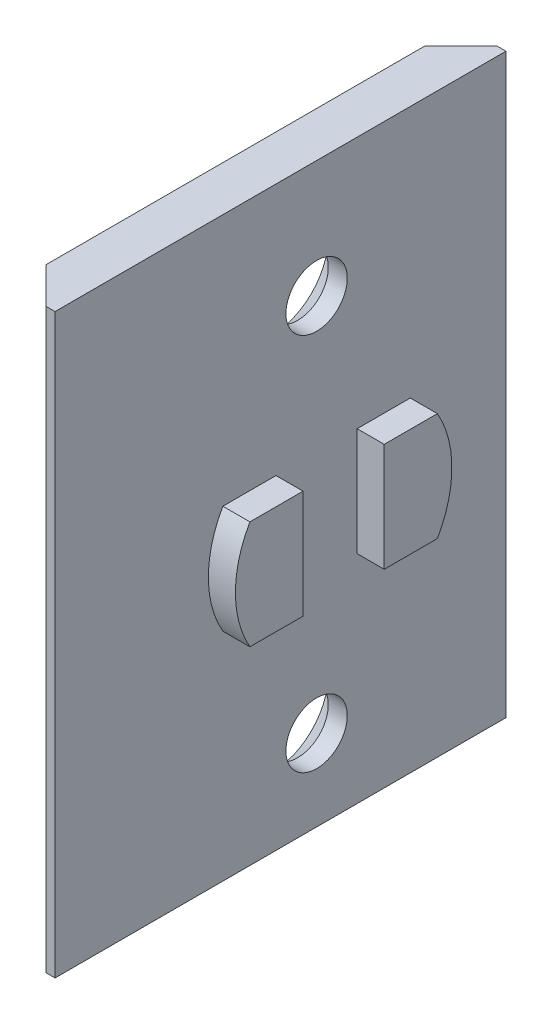
ISO-10303-21;
HEADER;
FILE_DESCRIPTION(('STEP AP214'),'2;1');
FILE_NAME('part.step','',(''),(''),'','','');
FILE_SCHEMA(('AUTOMOTIVE_DESIGN { 1 0 10303 214 1 1 1 1 }'));
ENDSEC;
DATA;
#1=APPLICATION_CONTEXT('core data for automotive mechanical design processes');
#2=APPLICATION_PROTOCOL_DEFINITION('international standard','automotive_design',2000,#1);
#3=PRODUCT_CONTEXT('',#1,'mechanical');
#4=PRODUCT('Part','Part','',(#3));
#5=PRODUCT_RELATED_PRODUCT_CATEGORY('part','',(#4));
#6=PRODUCT_DEFINITION_FORMATION('','',#4);
#7=PRODUCT_DEFINITION_CONTEXT('part definition',#1,'design');
#8=PRODUCT_DEFINITION('design','',#6,#7);
#9=PRODUCT_DEFINITION_SHAPE('','',#8);
#10=(LENGTH_UNIT() NAMED_UNIT(*) SI_UNIT(.MILLI.,.METRE.));
#11=(NAMED_UNIT(*) PLANE_ANGLE_UNIT() SI_UNIT($,.RADIAN.));
#12=(NAMED_UNIT(*) SI_UNIT($,.STERADIAN.) SOLID_ANGLE_UNIT());
#13=UNCERTAINTY_MEASURE_WITH_UNIT(LENGTH_MEASURE(1.E-05),#10,'distance_accuracy_value','');
#14=(GEOMETRIC_REPRESENTATION_CONTEXT(3) GLOBAL_UNCERTAINTY_ASSIGNED_CONTEXT((#13)) GLOBAL_UNIT_ASSIGNED_CONTEXT((#10,
#11,#12)) REPRESENTATION_CONTEXT('',''));
#15=CARTESIAN_POINT('',(0.,0.,0.));
#16=DIRECTION('',(0.,0.,1.));
#17=DIRECTION('',(1.,0.,0.));
#18=AXIS2_PLACEMENT_3D('',#15,#16,#17);
#19=CARTESIAN_POINT('',(4.,-1.,-2.00000000000008));
#20=DIRECTION('',(-1.,0.,0.));
#21=DIRECTION('',(0.,0.,1.00000000000003));
#22=AXIS2_PLACEMENT_3D('',#19,#20,#21);
#23=CYLINDRICAL_SURFACE('',#22,6.);
#24=DIRECTION('',(1.,0.,0.));
#25=VECTOR('',#24,1.);
#26=CARTESIAN_POINT('',(-8.31665382639201,-4.,3.19615242270658));
#27=LINE('',#26,#25);
#28=CARTESIAN_POINT('',(2.49999999999999,-4.,3.19615242270658));
#29=VERTEX_POINT('',#28);
#30=CARTESIAN_POINT('',(3.99999999999999,-4.,3.19615242270661));
#31=VERTEX_POINT('',#30);
#32=EDGE_CURVE('E51',#29,#31,#27,.T.);
#33=ORIENTED_EDGE('',*,*,#32,.T.);
#34=CARTESIAN_POINT('',(4.,-1.,-2.00000000000008));
#35=DIRECTION('',(1.,0.,0.));
#36=DIRECTION('',(0.,0.,-1.00000000000003));
#37=AXIS2_PLACEMENT_3D('',#34,#35,#36);
#38=CIRCLE('',#37,6.);
#39=CARTESIAN_POINT('',(4.,2.,3.19615242270661));
#40=VERTEX_POINT('',#39);
#41=EDGE_CURVE('E181',#40,#31,#38,.T.);
#42=ORIENTED_EDGE('',*,*,#41,.F.);
#43=DIRECTION('',(1.,0.,0.));
#44=VECTOR('',#43,1.);
#45=CARTESIAN_POINT('',(-8.31665382639201,2.00000000000001,3.19615242270658));
#46=LINE('',#45,#44);
#47=CARTESIAN_POINT('',(2.49999999999999,2.,3.1961524227066));
#48=VERTEX_POINT('',#47);
#49=EDGE_CURVE('E160',#48,#40,#46,.T.);
#50=ORIENTED_EDGE('',*,*,#49,.F.);
#51=CARTESIAN_POINT('',(2.5,-1.,-2.00000000000008));
#52=DIRECTION('',(-1.,0.,0.));
#53=DIRECTION('',(0.,0.,1.00000000000003));
#54=AXIS2_PLACEMENT_3D('',#51,#52,#53);
#55=CIRCLE('',#54,6.);
#56=EDGE_CURVE('E40',#48,#29,#55,.F.);
#57=ORIENTED_EDGE('',*,*,#56,.T.);
#58=EDGE_LOOP('',(#33,#42,#50,#57));
#59=FACE_BOUND('',#58,.T.);
#60=ADVANCED_FACE('F36',(#59),#23,.T.);
#61=CARTESIAN_POINT('',(4.,0.,0.));
#62=DIRECTION('',(1.,0.,0.));
#63=DIRECTION('',(0.,0.,-1.00000000000003));
#64=AXIS2_PLACEMENT_3D('',#61,#62,#63);
#65=PLANE('',#64);
#66=ORIENTED_EDGE('',*,*,#41,.T.);
#67=DIRECTION('',(0.,0.,-1.));
#68=VECTOR('',#67,1.);
#69=CARTESIAN_POINT('',(4.,-4.,0.));
#70=LINE('',#69,#68);
#71=CARTESIAN_POINT('',(4.,-4.,0.249999999999981));
#72=VERTEX_POINT('',#71);
#73=EDGE_CURVE('E258',#31,#72,#70,.T.);
#74=ORIENTED_EDGE('',*,*,#73,.T.);
#75=DIRECTION('',(0.,1.,0.));
#76=VECTOR('',#75,1.);
#77=CARTESIAN_POINT('',(4.,0.,0.24999999999999));
#78=LINE('',#77,#76);
#79=CARTESIAN_POINT('',(4.,2.,0.249999999999999));
#80=VERTEX_POINT('',#79);
#81=EDGE_CURVE('E177',#72,#80,#78,.T.);
#82=ORIENTED_EDGE('',*,*,#81,.T.);
#83=DIRECTION('',(0.,0.,-1.));
#84=VECTOR('',#83,1.);
#85=CARTESIAN_POINT('',(4.,2.,0.));
#86=LINE('',#85,#84);
#87=EDGE_CURVE('E164',#40,#80,#86,.T.);
#88=ORIENTED_EDGE('',*,*,#87,.F.);
#89=EDGE_LOOP('',(#66,#74,#82,#88));
#90=FACE_BOUND('',#89,.T.);
#91=ADVANCED_FACE('F279',(#90),#65,.T.);
#92=CARTESIAN_POINT('',(4.,0.,-4.25000000000015));
#93=DIRECTION('',(0.,0.,1.00000000000003));
#94=DIRECTION('',(1.,0.,0.));
#95=AXIS2_PLACEMENT_3D('',#92,#93,#94);
#96=PLANE('',#95);
#97=DIRECTION('',(0.,1.,0.));
#98=VECTOR('',#97,1.);
#99=CARTESIAN_POINT('',(2.5,0.,-4.25000000000015));
#100=LINE('',#99,#98);
#101=CARTESIAN_POINT('',(2.5,-4.,-4.25000000000016));
#102=VERTEX_POINT('',#101);
#103=CARTESIAN_POINT('',(2.50000000000001,2.,-4.25000000000015));
#104=VERTEX_POINT('',#103);
#105=EDGE_CURVE('E155',#102,#104,#100,.T.);
#106=ORIENTED_EDGE('',*,*,#105,.F.);
#107=DIRECTION('',(1.,0.,0.));
#108=VECTOR('',#107,1.);
#109=CARTESIAN_POINT('',(4.,-4.,-4.25000000000017));
#110=LINE('',#109,#108);
#111=CARTESIAN_POINT('',(4.,-4.,-4.25000000000009));
#112=VERTEX_POINT('',#111);
#113=EDGE_CURVE('E141',#102,#112,#110,.T.);
#114=ORIENTED_EDGE('',*,*,#113,.T.);
#115=DIRECTION('',(0.,1.,0.));
#116=VECTOR('',#115,1.);
#117=CARTESIAN_POINT('',(4.,0.,-4.25000000000015));
#118=LINE('',#117,#116);
#119=CARTESIAN_POINT('',(4.00000000000001,2.,-4.25000000000009));
#120=VERTEX_POINT('',#119);
#121=EDGE_CURVE('E175',#112,#120,#118,.T.);
#122=ORIENTED_EDGE('',*,*,#121,.T.);
#123=DIRECTION('',(1.,0.,0.));
#124=VECTOR('',#123,1.);
#125=CARTESIAN_POINT('',(4.,2.,-4.25000000000014));
#126=LINE('',#125,#124);
#127=EDGE_CURVE('E173',#104,#120,#126,.T.);
#128=ORIENTED_EDGE('',*,*,#127,.F.);
#129=EDGE_LOOP('',(#106,#114,#122,#128));
#130=FACE_BOUND('',#129,.T.);
#131=ADVANCED_FACE('F282',(#130),#96,.T.);
#132=CARTESIAN_POINT('',(4.,0.,0.24999999999999));
#133=DIRECTION('',(0.,0.,1.00000000000003));
#134=DIRECTION('',(1.,0.,0.));
#135=AXIS2_PLACEMENT_3D('',#132,#133,#134);
#136=PLANE('',#135);
#137=DIRECTION('',(1.,0.,0.));
#138=VECTOR('',#137,1.);
#139=CARTESIAN_POINT('',(4.,-4.,0.24999999999998));
#140=LINE('',#139,#138);
#141=CARTESIAN_POINT('',(2.5,-4.,0.250000000000006));
#142=VERTEX_POINT('',#141);
#143=EDGE_CURVE('E262',#142,#72,#140,.T.);
#144=ORIENTED_EDGE('',*,*,#143,.F.);
#145=DIRECTION('',(0.,1.,0.));
#146=VECTOR('',#145,1.);
#147=CARTESIAN_POINT('',(2.5,0.,0.24999999999999));
#148=LINE('',#147,#146);
#149=CARTESIAN_POINT('',(2.5,2.,0.250000000000005));
#150=VERTEX_POINT('',#149);
#151=EDGE_CURVE('E178',#142,#150,#148,.T.);
#152=ORIENTED_EDGE('',*,*,#151,.T.);
#153=DIRECTION('',(1.,0.,0.));
#154=VECTOR('',#153,1.);
#155=CARTESIAN_POINT('',(4.,2.,0.249999999999997));
#156=LINE('',#155,#154);
#157=EDGE_CURVE('E170',#150,#80,#156,.T.);
#158=ORIENTED_EDGE('',*,*,#157,.T.);
#159=ORIENTED_EDGE('',*,*,#81,.F.);
#160=EDGE_LOOP('',(#144,#152,#158,#159));
#161=FACE_BOUND('',#160,.T.);
#162=ADVANCED_FACE('F276',(#161),#136,.F.);
#163=DIRECTION('',(1.,0.,0.));
#164=VECTOR('',#163,1.);
#165=CARTESIAN_POINT('',(-8.31665382639199,-4.,-7.19615242270676));
#166=LINE('',#165,#164);
#167=CARTESIAN_POINT('',(2.49999999999999,-4.,-7.19615242270674));
#168=VERTEX_POINT('',#167);
#169=CARTESIAN_POINT('',(4.00000000000001,-4.,-7.19615242270674));
#170=VERTEX_POINT('',#169);
#171=EDGE_CURVE('E138',#168,#170,#166,.T.);
#172=ORIENTED_EDGE('',*,*,#171,.F.);
#173=CARTESIAN_POINT('',(2.50000000000001,2.,-7.19615242270674));
#174=VERTEX_POINT('',#173);
#175=EDGE_CURVE('E11',#168,#174,#55,.F.);
#176=ORIENTED_EDGE('',*,*,#175,.T.);
#177=DIRECTION('',(1.,0.,0.));
#178=VECTOR('',#177,1.);
#179=CARTESIAN_POINT('',(-8.31665382639199,2.00000000000001,-7.19615242270676));
#180=LINE('',#179,#178);
#181=CARTESIAN_POINT('',(4.00000000000001,2.,-7.19615242270674));
#182=VERTEX_POINT('',#181);
#183=EDGE_CURVE('E163',#174,#182,#180,.T.);
#184=ORIENTED_EDGE('',*,*,#183,.T.);
#185=EDGE_CURVE('E148',#170,#182,#38,.T.);
#186=ORIENTED_EDGE('',*,*,#185,.F.);
#187=EDGE_LOOP('',(#172,#176,#184,#186));
#188=FACE_BOUND('',#187,.T.);
#189=ADVANCED_FACE('F147',(#188),#23,.T.);
#190=ORIENTED_EDGE('',*,*,#121,.F.);
#191=EDGE_CURVE('E261',#112,#170,#70,.T.);
#192=ORIENTED_EDGE('',*,*,#191,.T.);
#193=ORIENTED_EDGE('',*,*,#185,.T.);
#194=EDGE_CURVE('E263',#120,#182,#86,.T.);
#195=ORIENTED_EDGE('',*,*,#194,.F.);
#196=EDGE_LOOP('',(#190,#192,#193,#195));
#197=FACE_BOUND('',#196,.T.);
#198=ADVANCED_FACE('F281',(#197),#65,.T.);
#199=CARTESIAN_POINT('',(2.5,-16.,-12.5000000000003));
#200=DIRECTION('',(0.,0.,1.00000000000003));
#201=DIRECTION('',(1.,0.,0.));
#202=AXIS2_PLACEMENT_3D('',#199,#200,#201);
#203=PLANE('',#202);
#204=DIRECTION('',(-1.,0.,0.));
#205=VECTOR('',#204,1.);
#206=CARTESIAN_POINT('',(2.5,-16.,-12.5000000000003));
#207=LINE('',#206,#205);
#208=CARTESIAN_POINT('',(2.5,-16.,-12.5000000000003));
#209=VERTEX_POINT('',#208);
#210=CARTESIAN_POINT('',(2.,-16.,-12.5000000000003));
#211=VERTEX_POINT('',#210);
#212=EDGE_CURVE('E213',#209,#211,#207,.T.);
#213=ORIENTED_EDGE('',*,*,#212,.T.);
#214=DIRECTION('',(0.,1.,0.));
#215=VECTOR('',#214,1.);
#216=CARTESIAN_POINT('',(2.,16.,-12.5000000000005));
#217=LINE('',#216,#215);
#218=CARTESIAN_POINT('',(2.,16.,-12.5000000000005));
#219=VERTEX_POINT('',#218);
#220=EDGE_CURVE('E243',#211,#219,#217,.T.);
#221=ORIENTED_EDGE('',*,*,#220,.T.);
#222=DIRECTION('',(-1.,0.,0.));
#223=VECTOR('',#222,1.);
#224=CARTESIAN_POINT('',(2.5,16.,-12.5000000000005));
#225=LINE('',#224,#223);
#226=CARTESIAN_POINT('',(2.5,16.,-12.5000000000005));
#227=VERTEX_POINT('',#226);
#228=EDGE_CURVE('E226',#227,#219,#225,.T.);
#229=ORIENTED_EDGE('',*,*,#228,.F.);
#230=DIRECTION('',(0.,1.,0.));
#231=VECTOR('',#230,1.);
#232=CARTESIAN_POINT('',(2.5,-16.,-12.5000000000003));
#233=LINE('',#232,#231);
#234=EDGE_CURVE('E203',#209,#227,#233,.T.);
#235=ORIENTED_EDGE('',*,*,#234,.F.);
#236=EDGE_LOOP('',(#213,#221,#229,#235));
#237=FACE_BOUND('',#236,.T.);
#238=ADVANCED_FACE('F305',(#237),#203,.F.);
#239=CARTESIAN_POINT('',(2.5,16.,12.5000000000005));
#240=DIRECTION('',(0.,-1.,0.));
#241=DIRECTION('',(0.,0.,-1.00000000000003));
#242=AXIS2_PLACEMENT_3D('',#239,#240,#241);
#243=PLANE('',#242);
#244=DIRECTION('',(0.,0.,1.00000000000003));
#245=VECTOR('',#244,1.);
#246=CARTESIAN_POINT('',(0.,16.,12.5000000000003));
#247=LINE('',#246,#245);
#248=CARTESIAN_POINT('',(0.,16.,-10.5000000000005));
#249=VERTEX_POINT('',#248);
#250=CARTESIAN_POINT('',(0.,16.,10.5000000000003));
#251=VERTEX_POINT('',#250);
#252=EDGE_CURVE('E202',#249,#251,#247,.T.);
#253=ORIENTED_EDGE('',*,*,#252,.T.);
#254=DIRECTION('',(0.707106781186547,0.,0.707106781186565));
#255=VECTOR('',#254,1.);
#256=CARTESIAN_POINT('',(2.,16.,12.5000000000005));
#257=LINE('',#256,#255);
#258=CARTESIAN_POINT('',(2.,16.,12.5000000000005));
#259=VERTEX_POINT('',#258);
#260=EDGE_CURVE('E242',#251,#259,#257,.T.);
#261=ORIENTED_EDGE('',*,*,#260,.T.);
#262=DIRECTION('',(-1.,0.,0.));
#263=VECTOR('',#262,1.);
#264=CARTESIAN_POINT('',(2.5,16.,12.5000000000005));
#265=LINE('',#264,#263);
#266=CARTESIAN_POINT('',(2.5,16.,12.5000000000005));
#267=VERTEX_POINT('',#266);
#268=EDGE_CURVE('E223',#267,#259,#265,.T.);
#269=ORIENTED_EDGE('',*,*,#268,.F.);
#270=DIRECTION('',(0.,0.,1.00000000000003));
#271=VECTOR('',#270,1.);
#272=CARTESIAN_POINT('',(2.5,16.,12.5000000000005));
#273=LINE('',#272,#271);
#274=EDGE_CURVE('E206',#227,#267,#273,.T.);
#275=ORIENTED_EDGE('',*,*,#274,.F.);
#276=ORIENTED_EDGE('',*,*,#228,.T.);
#277=DIRECTION('',(-0.707106781186547,0.,0.707106781186565));
#278=VECTOR('',#277,1.);
#279=CARTESIAN_POINT('',(2.,16.,-12.5000000000005));
#280=LINE('',#279,#278);
#281=EDGE_CURVE('E240',#219,#249,#280,.T.);
#282=ORIENTED_EDGE('',*,*,#281,.T.);
#283=EDGE_LOOP('',(#253,#261,#269,#275,#276,#282));
#284=FACE_BOUND('',#283,.T.);
#285=ADVANCED_FACE('F338',(#284),#243,.F.);
#286=CARTESIAN_POINT('',(2.5,-16.,12.5000000000005));
#287=DIRECTION('',(0.,0.,-1.00000000000003));
#288=DIRECTION('',(-1.,0.,0.));
#289=AXIS2_PLACEMENT_3D('',#286,#287,#288);
#290=PLANE('',#289);
#291=ORIENTED_EDGE('',*,*,#268,.T.);
#292=DIRECTION('',(0.,-1.,0.));
#293=VECTOR('',#292,1.);
#294=CARTESIAN_POINT('',(2.,-16.,12.5000000000005));
#295=LINE('',#294,#293);
#296=CARTESIAN_POINT('',(2.,-16.,12.5000000000005));
#297=VERTEX_POINT('',#296);
#298=EDGE_CURVE('E229',#259,#297,#295,.T.);
#299=ORIENTED_EDGE('',*,*,#298,.T.);
#300=DIRECTION('',(-1.,0.,0.));
#301=VECTOR('',#300,1.);
#302=CARTESIAN_POINT('',(2.5,-16.,12.5000000000005));
#303=LINE('',#302,#301);
#304=CARTESIAN_POINT('',(2.5,-16.,12.5000000000005));
#305=VERTEX_POINT('',#304);
#306=EDGE_CURVE('E220',#305,#297,#303,.T.);
#307=ORIENTED_EDGE('',*,*,#306,.F.);
#308=DIRECTION('',(0.,-1.,0.));
#309=VECTOR('',#308,1.);
#310=CARTESIAN_POINT('',(2.5,-16.,12.5000000000005));
#311=LINE('',#310,#309);
#312=EDGE_CURVE('E209',#267,#305,#311,.T.);
#313=ORIENTED_EDGE('',*,*,#312,.F.);
#314=EDGE_LOOP('',(#291,#299,#307,#313));
#315=FACE_BOUND('',#314,.T.);
#316=ADVANCED_FACE('F334',(#315),#290,.F.);
#317=CARTESIAN_POINT('',(2.5,-16.,12.5000000000005));
#318=DIRECTION('',(0.,1.,0.));
#319=DIRECTION('',(0.,0.,1.00000000000003));
#320=AXIS2_PLACEMENT_3D('',#317,#318,#319);
#321=PLANE('',#320);
#322=ORIENTED_EDGE('',*,*,#306,.T.);
#323=DIRECTION('',(-0.707106781186547,0.,-0.707106781186565));
#324=VECTOR('',#323,1.);
#325=CARTESIAN_POINT('',(2.,-16.,12.5000000000005));
#326=LINE('',#325,#324);
#327=CARTESIAN_POINT('',(0.,-16.,10.5000000000005));
#328=VERTEX_POINT('',#327);
#329=EDGE_CURVE('E234',#297,#328,#326,.T.);
#330=ORIENTED_EDGE('',*,*,#329,.T.);
#331=DIRECTION('',(0.,0.,-1.00000000000003));
#332=VECTOR('',#331,1.);
#333=CARTESIAN_POINT('',(0.,-16.,12.5000000000005));
#334=LINE('',#333,#332);
#335=CARTESIAN_POINT('',(0.,-16.,-10.5000000000003));
#336=VERTEX_POINT('',#335);
#337=EDGE_CURVE('E207',#328,#336,#334,.T.);
#338=ORIENTED_EDGE('',*,*,#337,.T.);
#339=DIRECTION('',(0.707106781186547,0.,-0.707106781186565));
#340=VECTOR('',#339,1.);
#341=CARTESIAN_POINT('',(2.,-16.,-12.5000000000003));
#342=LINE('',#341,#340);
#343=EDGE_CURVE('E232',#336,#211,#342,.T.);
#344=ORIENTED_EDGE('',*,*,#343,.T.);
#345=ORIENTED_EDGE('',*,*,#212,.F.);
#346=DIRECTION('',(0.,0.,-1.00000000000003));
#347=VECTOR('',#346,1.);
#348=CARTESIAN_POINT('',(2.5,-16.,12.5000000000005));
#349=LINE('',#348,#347);
#350=EDGE_CURVE('E211',#305,#209,#349,.T.);
#351=ORIENTED_EDGE('',*,*,#350,.F.);
#352=EDGE_LOOP('',(#322,#330,#338,#344,#345,#351));
#353=FACE_BOUND('',#352,.T.);
#354=ADVANCED_FACE('F330',(#353),#321,.F.);
#355=CARTESIAN_POINT('',(0.,0.,0.));
#356=DIRECTION('',(-1.,0.,0.));
#357=DIRECTION('',(0.,0.,1.00000000000003));
#358=AXIS2_PLACEMENT_3D('',#355,#356,#357);
#359=PLANE('',#358);
#360=CARTESIAN_POINT('',(0.,-11.5,-2.00000000000008));
#361=DIRECTION('',(-1.,0.,0.));
#362=DIRECTION('',(0.,0.,1.00000000000003));
#363=AXIS2_PLACEMENT_3D('',#360,#361,#362);
#364=CIRCLE('',#363,3.15);
#365=CARTESIAN_POINT('',(0.,-11.5,1.15000000000003));
#366=VERTEX_POINT('',#365);
#367=EDGE_CURVE('E184',#366,#366,#364,.T.);
#368=ORIENTED_EDGE('',*,*,#367,.F.);
#369=EDGE_LOOP('',(#368));
#370=FACE_BOUND('',#369,.T.);
#371=CARTESIAN_POINT('',(0.,9.5,-2.00000000000015));
#372=DIRECTION('',(-1.,0.,0.));
#373=DIRECTION('',(0.,0.,1.00000000000003));
#374=AXIS2_PLACEMENT_3D('',#371,#372,#373);
#375=CIRCLE('',#374,3.15);
#376=CARTESIAN_POINT('',(0.,9.49999999999999,1.14999999999996));
#377=VERTEX_POINT('',#376);
#378=EDGE_CURVE('E193',#377,#377,#375,.T.);
#379=ORIENTED_EDGE('',*,*,#378,.F.);
#380=EDGE_LOOP('',(#379));
#381=FACE_BOUND('',#380,.T.);
#382=ORIENTED_EDGE('',*,*,#337,.F.);
#383=DIRECTION('',(0.,1.,0.));
#384=VECTOR('',#383,1.);
#385=CARTESIAN_POINT('',(0.,16.,10.5000000000003));
#386=LINE('',#385,#384);
#387=EDGE_CURVE('E238',#328,#251,#386,.T.);
#388=ORIENTED_EDGE('',*,*,#387,.T.);
#389=ORIENTED_EDGE('',*,*,#252,.F.);
#390=DIRECTION('',(0.,-1.,0.));
#391=VECTOR('',#390,1.);
#392=CARTESIAN_POINT('',(0.,-16.,-10.5000000000003));
#393=LINE('',#392,#391);
#394=EDGE_CURVE('E236',#249,#336,#393,.T.);
#395=ORIENTED_EDGE('',*,*,#394,.T.);
#396=EDGE_LOOP('',(#382,#388,#389,#395));
#397=FACE_BOUND('',#396,.T.);
#398=ADVANCED_FACE('F326',(#370,#381,#397),#359,.T.);
#399=CARTESIAN_POINT('',(2.,-16.,12.5000000000005));
#400=DIRECTION('',(-0.707106781186548,0.,0.707106781186564));
#401=DIRECTION('',(0.,1.,0.));
#402=AXIS2_PLACEMENT_3D('',#399,#400,#401);
#403=PLANE('',#402);
#404=ORIENTED_EDGE('',*,*,#260,.F.);
#405=ORIENTED_EDGE('',*,*,#387,.F.);
#406=ORIENTED_EDGE('',*,*,#329,.F.);
#407=ORIENTED_EDGE('',*,*,#298,.F.);
#408=EDGE_LOOP('',(#404,#405,#406,#407));
#409=FACE_BOUND('',#408,.T.);
#410=ADVANCED_FACE('F329',(#409),#403,.T.);
#411=CARTESIAN_POINT('',(2.,-16.,-12.5000000000003));
#412=DIRECTION('',(-0.707106781186548,0.,-0.707106781186564));
#413=DIRECTION('',(0.,-1.,0.));
#414=AXIS2_PLACEMENT_3D('',#411,#412,#413);
#415=PLANE('',#414);
#416=ORIENTED_EDGE('',*,*,#343,.F.);
#417=ORIENTED_EDGE('',*,*,#394,.F.);
#418=ORIENTED_EDGE('',*,*,#281,.F.);
#419=ORIENTED_EDGE('',*,*,#220,.F.);
#420=EDGE_LOOP('',(#416,#417,#418,#419));
#421=FACE_BOUND('',#420,.T.);
#422=ADVANCED_FACE('F38',(#421),#415,.T.);
#423=CARTESIAN_POINT('',(0.,9.5,-2.00000000000015));
#424=DIRECTION('',(-1.,0.,0.));
#425=DIRECTION('',(0.,0.,1.00000000000003));
#426=AXIS2_PLACEMENT_3D('',#423,#424,#425);
#427=CYLINDRICAL_SURFACE('',#426,1.7);
#428=CARTESIAN_POINT('',(2.5,9.5,-2.00000000000015));
#429=DIRECTION('',(-1.,0.,0.));
#430=DIRECTION('',(0.,0.,1.00000000000003));
#431=AXIS2_PLACEMENT_3D('',#428,#429,#430);
#432=CIRCLE('',#431,1.7);
#433=CARTESIAN_POINT('',(2.5,9.49999999999999,-0.300000000000093));
#434=VERTEX_POINT('',#433);
#435=EDGE_CURVE('E199',#434,#434,#432,.T.);
#436=ORIENTED_EDGE('',*,*,#435,.F.);
#437=EDGE_LOOP('',(#436));
#438=FACE_BOUND('',#437,.T.);
#439=CARTESIAN_POINT('',(1.45,9.5,-2.00000000000015));
#440=DIRECTION('',(-1.,0.,0.));
#441=DIRECTION('',(0.,0.,1.00000000000003));
#442=AXIS2_PLACEMENT_3D('',#439,#440,#441);
#443=CIRCLE('',#442,1.7);
#444=CARTESIAN_POINT('',(1.45000000000001,9.49999999999999,-0.300000000000093));
#445=VERTEX_POINT('',#444);
#446=EDGE_CURVE('E196',#445,#445,#443,.T.);
#447=ORIENTED_EDGE('',*,*,#446,.T.);
#448=EDGE_LOOP('',(#447));
#449=FACE_BOUND('',#448,.T.);
#450=ADVANCED_FACE('F321',(#438,#449),#427,.F.);
#451=CARTESIAN_POINT('',(0.,9.5,-2.00000000000015));
#452=DIRECTION('',(-1.,0.,0.));
#453=DIRECTION('',(0.,0.,1.00000000000003));
#454=AXIS2_PLACEMENT_3D('',#451,#452,#453);
#455=CONICAL_SURFACE('',#454,3.15,0.785398163397448);
#456=ORIENTED_EDGE('',*,*,#446,.F.);
#457=EDGE_LOOP('',(#456));
#458=FACE_BOUND('',#457,.T.);
#459=ORIENTED_EDGE('',*,*,#378,.T.);
#460=EDGE_LOOP('',(#459));
#461=FACE_BOUND('',#460,.T.);
#462=ADVANCED_FACE('F317',(#458,#461),#455,.F.);
#463=CARTESIAN_POINT('',(0.,-11.5,-2.00000000000008));
#464=DIRECTION('',(-1.,0.,0.));
#465=DIRECTION('',(0.,0.,1.00000000000003));
#466=AXIS2_PLACEMENT_3D('',#463,#464,#465);
#467=CYLINDRICAL_SURFACE('',#466,1.7);
#468=CARTESIAN_POINT('',(2.5,-11.5,-2.00000000000001));
#469=DIRECTION('',(-1.,0.,0.));
#470=DIRECTION('',(0.,0.,1.00000000000003));
#471=AXIS2_PLACEMENT_3D('',#468,#469,#470);
#472=CIRCLE('',#471,1.7);
#473=CARTESIAN_POINT('',(2.5,-11.5,-0.299999999999956));
#474=VERTEX_POINT('',#473);
#475=EDGE_CURVE('E190',#474,#474,#472,.T.);
#476=ORIENTED_EDGE('',*,*,#475,.F.);
#477=EDGE_LOOP('',(#476));
#478=FACE_BOUND('',#477,.T.);
#479=CARTESIAN_POINT('',(1.45,-11.5,-2.00000000000001));
#480=DIRECTION('',(-1.,0.,0.));
#481=DIRECTION('',(0.,0.,1.00000000000003));
#482=AXIS2_PLACEMENT_3D('',#479,#480,#481);
#483=CIRCLE('',#482,1.7);
#484=CARTESIAN_POINT('',(1.45000000000001,-11.5,-0.299999999999956));
#485=VERTEX_POINT('',#484);
#486=EDGE_CURVE('E187',#485,#485,#483,.T.);
#487=ORIENTED_EDGE('',*,*,#486,.T.);
#488=EDGE_LOOP('',(#487));
#489=FACE_BOUND('',#488,.T.);
#490=ADVANCED_FACE('F313',(#478,#489),#467,.F.);
#491=CARTESIAN_POINT('',(0.,-11.5,-2.00000000000008));
#492=DIRECTION('',(-1.,0.,0.));
#493=DIRECTION('',(0.,0.,1.00000000000003));
#494=AXIS2_PLACEMENT_3D('',#491,#492,#493);
#495=CONICAL_SURFACE('',#494,3.15,0.785398163397448);
#496=ORIENTED_EDGE('',*,*,#486,.F.);
#497=EDGE_LOOP('',(#496));
#498=FACE_BOUND('',#497,.T.);
#499=ORIENTED_EDGE('',*,*,#367,.T.);
#500=EDGE_LOOP('',(#499));
#501=FACE_BOUND('',#500,.T.);
#502=ADVANCED_FACE('F290',(#498,#501),#495,.F.);
#503=CARTESIAN_POINT('',(2.5,0.,0.));
#504=DIRECTION('',(-1.,0.,0.));
#505=DIRECTION('',(0.,0.,1.00000000000003));
#506=AXIS2_PLACEMENT_3D('',#503,#504,#505);
#507=PLANE('',#506);
#508=DIRECTION('',(0.,0.,-1.));
#509=VECTOR('',#508,1.);
#510=CARTESIAN_POINT('',(2.5,-4.,0.));
#511=LINE('',#510,#509);
#512=EDGE_CURVE('E136',#102,#168,#511,.T.);
#513=ORIENTED_EDGE('',*,*,#512,.F.);
#514=ORIENTED_EDGE('',*,*,#105,.T.);
#515=DIRECTION('',(0.,0.,-1.));
#516=VECTOR('',#515,1.);
#517=CARTESIAN_POINT('',(2.5,2.,0.));
#518=LINE('',#517,#516);
#519=EDGE_CURVE('E154',#104,#174,#518,.T.);
#520=ORIENTED_EDGE('',*,*,#519,.T.);
#521=ORIENTED_EDGE('',*,*,#175,.F.);
#522=EDGE_LOOP('',(#513,#514,#520,#521));
#523=FACE_BOUND('',#522,.T.);
#524=ORIENTED_EDGE('',*,*,#151,.F.);
#525=EDGE_CURVE('E144',#29,#142,#511,.T.);
#526=ORIENTED_EDGE('',*,*,#525,.F.);
#527=ORIENTED_EDGE('',*,*,#56,.F.);
#528=EDGE_CURVE('E159',#48,#150,#518,.T.);
#529=ORIENTED_EDGE('',*,*,#528,.T.);
#530=EDGE_LOOP('',(#524,#526,#527,#529));
#531=FACE_BOUND('',#530,.T.);
#532=ORIENTED_EDGE('',*,*,#234,.T.);
#533=ORIENTED_EDGE('',*,*,#274,.T.);
#534=ORIENTED_EDGE('',*,*,#312,.T.);
#535=ORIENTED_EDGE('',*,*,#350,.T.);
#536=EDGE_LOOP('',(#532,#533,#534,#535));
#537=FACE_BOUND('',#536,.T.);
#538=ORIENTED_EDGE('',*,*,#435,.T.);
#539=EDGE_LOOP('',(#538));
#540=FACE_BOUND('',#539,.T.);
#541=ORIENTED_EDGE('',*,*,#475,.T.);
#542=EDGE_LOOP('',(#541));
#543=FACE_BOUND('',#542,.T.);
#544=ADVANCED_FACE('F151',(#523,#531,#537,#540,#543),#507,.F.);
#545=CARTESIAN_POINT('',(-8.31665382639201,2.00000000000001,0.));
#546=DIRECTION('',(0.,-1.,0.));
#547=DIRECTION('',(1.,0.,0.));
#548=AXIS2_PLACEMENT_3D('',#545,#546,#547);
#549=PLANE('',#548);
#550=ORIENTED_EDGE('',*,*,#127,.T.);
#551=ORIENTED_EDGE('',*,*,#194,.T.);
#552=ORIENTED_EDGE('',*,*,#183,.F.);
#553=ORIENTED_EDGE('',*,*,#519,.F.);
#554=EDGE_LOOP('',(#550,#551,#552,#553));
#555=FACE_BOUND('',#554,.T.);
#556=ADVANCED_FACE('F283',(#555),#549,.F.);
#557=ORIENTED_EDGE('',*,*,#528,.F.);
#558=ORIENTED_EDGE('',*,*,#49,.T.);
#559=ORIENTED_EDGE('',*,*,#87,.T.);
#560=ORIENTED_EDGE('',*,*,#157,.F.);
#561=EDGE_LOOP('',(#557,#558,#559,#560));
#562=FACE_BOUND('',#561,.T.);
#563=ADVANCED_FACE('F272',(#562),#549,.F.);
#564=CARTESIAN_POINT('',(-8.31665382639201,-4.,0.));
#565=DIRECTION('',(0.,-1.,0.));
#566=DIRECTION('',(1.,0.,0.));
#567=AXIS2_PLACEMENT_3D('',#564,#565,#566);
#568=PLANE('',#567);
#569=ORIENTED_EDGE('',*,*,#143,.T.);
#570=ORIENTED_EDGE('',*,*,#73,.F.);
#571=ORIENTED_EDGE('',*,*,#32,.F.);
#572=ORIENTED_EDGE('',*,*,#525,.T.);
#573=EDGE_LOOP('',(#569,#570,#571,#572));
#574=FACE_BOUND('',#573,.T.);
#575=ADVANCED_FACE('F278',(#574),#568,.T.);
#576=ORIENTED_EDGE('',*,*,#512,.T.);
#577=ORIENTED_EDGE('',*,*,#171,.T.);
#578=ORIENTED_EDGE('',*,*,#191,.F.);
#579=ORIENTED_EDGE('',*,*,#113,.F.);
#580=EDGE_LOOP('',(#576,#577,#578,#579));
#581=FACE_BOUND('',#580,.T.);
#582=ADVANCED_FACE('F137',(#581),#568,.T.);
#583=CLOSED_SHELL('',(#60,#91,#131,#162,#189,#198,#238,#285,#316,#354,#398,#410,#422,#450,#462,
#490,#502,#544,#556,#563,#575,#582));
#584=MANIFOLD_SOLID_BREP('B2',#583);
#585=ADVANCED_BREP_SHAPE_REPRESENTATION('',(#18,#584),#14);
#586=SHAPE_DEFINITION_REPRESENTATION(#9,#585);
ENDSEC;
END-ISO-10303-21;
